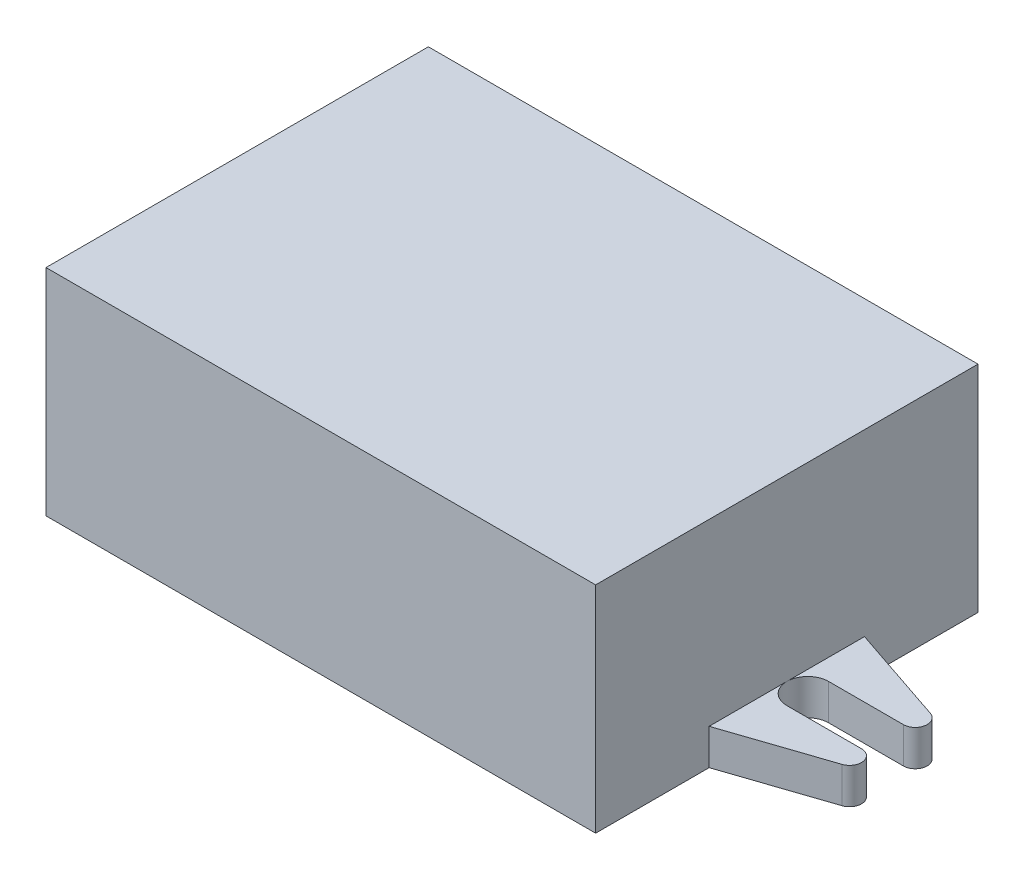
ISO-10303-21;
HEADER;
FILE_DESCRIPTION(('STEP AP214'),'2;1');
FILE_NAME('part.step','',(''),(''),'','','');
FILE_SCHEMA(('AUTOMOTIVE_DESIGN { 1 0 10303 214 1 1 1 1 }'));
ENDSEC;
DATA;
#1=APPLICATION_CONTEXT('core data for automotive mechanical design processes');
#2=APPLICATION_PROTOCOL_DEFINITION('international standard','automotive_design',2000,#1);
#3=PRODUCT_CONTEXT('',#1,'mechanical');
#4=PRODUCT('Part','Part','',(#3));
#5=PRODUCT_RELATED_PRODUCT_CATEGORY('part','',(#4));
#6=PRODUCT_DEFINITION_FORMATION('','',#4);
#7=PRODUCT_DEFINITION_CONTEXT('part definition',#1,'design');
#8=PRODUCT_DEFINITION('design','',#6,#7);
#9=PRODUCT_DEFINITION_SHAPE('','',#8);
#10=(LENGTH_UNIT() NAMED_UNIT(*) SI_UNIT(.MILLI.,.METRE.));
#11=(NAMED_UNIT(*) PLANE_ANGLE_UNIT() SI_UNIT($,.RADIAN.));
#12=(NAMED_UNIT(*) SI_UNIT($,.STERADIAN.) SOLID_ANGLE_UNIT());
#13=UNCERTAINTY_MEASURE_WITH_UNIT(LENGTH_MEASURE(1.E-05),#10,'distance_accuracy_value','');
#14=(GEOMETRIC_REPRESENTATION_CONTEXT(3) GLOBAL_UNCERTAINTY_ASSIGNED_CONTEXT((#13)) GLOBAL_UNIT_ASSIGNED_CONTEXT((#10,
#11,#12)) REPRESENTATION_CONTEXT('',''));
#15=CARTESIAN_POINT('',(0.,0.,0.));
#16=DIRECTION('',(0.,0.,1.));
#17=DIRECTION('',(1.,0.,0.));
#18=AXIS2_PLACEMENT_3D('',#15,#16,#17);
#19=CARTESIAN_POINT('',(23.,18.,16.));
#20=DIRECTION('',(-1.,0.,0.));
#21=DIRECTION('',(0.,0.,1.));
#22=AXIS2_PLACEMENT_3D('',#19,#20,#21);
#23=PLANE('',#22);
#24=DIRECTION('',(0.,0.,-1.));
#25=VECTOR('',#24,1.);
#26=CARTESIAN_POINT('',(23.,0.,16.));
#27=LINE('',#26,#25);
#28=CARTESIAN_POINT('',(23.,0.,16.));
#29=VERTEX_POINT('',#28);
#30=CARTESIAN_POINT('',(23.,0.,6.5));
#31=VERTEX_POINT('',#30);
#32=EDGE_CURVE('E331',#29,#31,#27,.T.);
#33=ORIENTED_EDGE('',*,*,#32,.T.);
#34=DIRECTION('',(0.,-1.,0.));
#35=VECTOR('',#34,1.);
#36=CARTESIAN_POINT('',(23.,3.,6.5));
#37=LINE('',#36,#35);
#38=CARTESIAN_POINT('',(23.,3.,6.5));
#39=VERTEX_POINT('',#38);
#40=EDGE_CURVE('E218',#39,#31,#37,.T.);
#41=ORIENTED_EDGE('',*,*,#40,.F.);
#42=DIRECTION('',(0.,0.,1.));
#43=VECTOR('',#42,1.);
#44=CARTESIAN_POINT('',(23.,3.,0.));
#45=LINE('',#44,#43);
#46=CARTESIAN_POINT('',(23.,3.,0.));
#47=VERTEX_POINT('',#46);
#48=EDGE_CURVE('E206',#47,#39,#45,.T.);
#49=ORIENTED_EDGE('',*,*,#48,.F.);
#50=DIRECTION('',(0.,0.,1.));
#51=VECTOR('',#50,1.);
#52=CARTESIAN_POINT('',(23.,3.,0.));
#53=LINE('',#52,#51);
#54=CARTESIAN_POINT('',(23.,3.,-6.5));
#55=VERTEX_POINT('',#54);
#56=EDGE_CURVE('E55',#55,#47,#53,.T.);
#57=ORIENTED_EDGE('',*,*,#56,.F.);
#58=DIRECTION('',(0.,-1.,0.));
#59=VECTOR('',#58,1.);
#60=CARTESIAN_POINT('',(23.,3.,-6.5));
#61=LINE('',#60,#59);
#62=CARTESIAN_POINT('',(23.,0.,-6.5));
#63=VERTEX_POINT('',#62);
#64=EDGE_CURVE('E236',#55,#63,#61,.T.);
#65=ORIENTED_EDGE('',*,*,#64,.T.);
#66=CARTESIAN_POINT('',(23.,0.,-16.));
#67=VERTEX_POINT('',#66);
#68=EDGE_CURVE('E319',#63,#67,#27,.T.);
#69=ORIENTED_EDGE('',*,*,#68,.T.);
#70=DIRECTION('',(0.,-1.,0.));
#71=VECTOR('',#70,1.);
#72=CARTESIAN_POINT('',(23.,18.,-16.));
#73=LINE('',#72,#71);
#74=CARTESIAN_POINT('',(23.,18.,-16.));
#75=VERTEX_POINT('',#74);
#76=EDGE_CURVE('E11',#75,#67,#73,.T.);
#77=ORIENTED_EDGE('',*,*,#76,.F.);
#78=DIRECTION('',(0.,0.,-1.));
#79=VECTOR('',#78,1.);
#80=CARTESIAN_POINT('',(23.,18.,16.));
#81=LINE('',#80,#79);
#82=CARTESIAN_POINT('',(23.,18.,16.));
#83=VERTEX_POINT('',#82);
#84=EDGE_CURVE('E320',#83,#75,#81,.T.);
#85=ORIENTED_EDGE('',*,*,#84,.F.);
#86=DIRECTION('',(0.,-1.,0.));
#87=VECTOR('',#86,1.);
#88=CARTESIAN_POINT('',(23.,18.,16.));
#89=LINE('',#88,#87);
#90=EDGE_CURVE('E330',#83,#29,#89,.T.);
#91=ORIENTED_EDGE('',*,*,#90,.T.);
#92=EDGE_LOOP('',(#33,#41,#49,#57,#65,#69,#77,#85,#91));
#93=FACE_BOUND('',#92,.T.);
#94=ADVANCED_FACE('F41',(#93),#23,.F.);
#95=CARTESIAN_POINT('',(-23.,18.,16.));
#96=DIRECTION('',(1.,0.,0.));
#97=DIRECTION('',(0.,0.,-1.));
#98=AXIS2_PLACEMENT_3D('',#95,#96,#97);
#99=PLANE('',#98);
#100=DIRECTION('',(0.,-1.,0.));
#101=VECTOR('',#100,1.);
#102=CARTESIAN_POINT('',(-23.,3.,6.5));
#103=LINE('',#102,#101);
#104=CARTESIAN_POINT('',(-23.,3.,6.5));
#105=VERTEX_POINT('',#104);
#106=CARTESIAN_POINT('',(-23.,0.,6.5));
#107=VERTEX_POINT('',#106);
#108=EDGE_CURVE('E263',#105,#107,#103,.T.);
#109=ORIENTED_EDGE('',*,*,#108,.T.);
#110=DIRECTION('',(0.,0.,1.));
#111=VECTOR('',#110,1.);
#112=CARTESIAN_POINT('',(-23.,0.,16.));
#113=LINE('',#112,#111);
#114=CARTESIAN_POINT('',(-23.,0.,16.));
#115=VERTEX_POINT('',#114);
#116=EDGE_CURVE('E336',#107,#115,#113,.T.);
#117=ORIENTED_EDGE('',*,*,#116,.T.);
#118=DIRECTION('',(0.,-1.,0.));
#119=VECTOR('',#118,1.);
#120=CARTESIAN_POINT('',(-23.,18.,16.));
#121=LINE('',#120,#119);
#122=CARTESIAN_POINT('',(-23.,18.,16.));
#123=VERTEX_POINT('',#122);
#124=EDGE_CURVE('E342',#123,#115,#121,.T.);
#125=ORIENTED_EDGE('',*,*,#124,.F.);
#126=DIRECTION('',(0.,0.,1.));
#127=VECTOR('',#126,1.);
#128=CARTESIAN_POINT('',(-23.,18.,16.));
#129=LINE('',#128,#127);
#130=CARTESIAN_POINT('',(-23.,18.,-16.));
#131=VERTEX_POINT('',#130);
#132=EDGE_CURVE('E326',#131,#123,#129,.T.);
#133=ORIENTED_EDGE('',*,*,#132,.F.);
#134=DIRECTION('',(0.,-1.,0.));
#135=VECTOR('',#134,1.);
#136=CARTESIAN_POINT('',(-23.,18.,-16.));
#137=LINE('',#136,#135);
#138=CARTESIAN_POINT('',(-23.,0.,-16.));
#139=VERTEX_POINT('',#138);
#140=EDGE_CURVE('E48',#131,#139,#137,.T.);
#141=ORIENTED_EDGE('',*,*,#140,.T.);
#142=CARTESIAN_POINT('',(-23.,0.,-6.5));
#143=VERTEX_POINT('',#142);
#144=EDGE_CURVE('E337',#139,#143,#113,.T.);
#145=ORIENTED_EDGE('',*,*,#144,.T.);
#146=DIRECTION('',(0.,-1.,0.));
#147=VECTOR('',#146,1.);
#148=CARTESIAN_POINT('',(-23.,3.,-6.5));
#149=LINE('',#148,#147);
#150=CARTESIAN_POINT('',(-23.,3.,-6.5));
#151=VERTEX_POINT('',#150);
#152=EDGE_CURVE('E312',#151,#143,#149,.T.);
#153=ORIENTED_EDGE('',*,*,#152,.F.);
#154=DIRECTION('',(0.,0.,1.));
#155=VECTOR('',#154,1.);
#156=CARTESIAN_POINT('',(-23.,3.,0.));
#157=LINE('',#156,#155);
#158=CARTESIAN_POINT('',(-23.,3.,0.));
#159=VERTEX_POINT('',#158);
#160=EDGE_CURVE('E295',#151,#159,#157,.T.);
#161=ORIENTED_EDGE('',*,*,#160,.T.);
#162=DIRECTION('',(0.,0.,1.));
#163=VECTOR('',#162,1.);
#164=CARTESIAN_POINT('',(-23.,3.,0.));
#165=LINE('',#164,#163);
#166=EDGE_CURVE('E63',#159,#105,#165,.T.);
#167=ORIENTED_EDGE('',*,*,#166,.T.);
#168=EDGE_LOOP('',(#109,#117,#125,#133,#141,#145,#153,#161,#167));
#169=FACE_BOUND('',#168,.T.);
#170=ADVANCED_FACE('F348',(#169),#99,.F.);
#171=CARTESIAN_POINT('',(-23.,18.,-16.));
#172=DIRECTION('',(0.,0.,1.));
#173=DIRECTION('',(1.,0.,0.));
#174=AXIS2_PLACEMENT_3D('',#171,#172,#173);
#175=PLANE('',#174);
#176=DIRECTION('',(-1.,0.,0.));
#177=VECTOR('',#176,1.);
#178=CARTESIAN_POINT('',(-23.,0.,-16.));
#179=LINE('',#178,#177);
#180=EDGE_CURVE('E334',#67,#139,#179,.T.);
#181=ORIENTED_EDGE('',*,*,#180,.T.);
#182=ORIENTED_EDGE('',*,*,#140,.F.);
#183=DIRECTION('',(-1.,0.,0.));
#184=VECTOR('',#183,1.);
#185=CARTESIAN_POINT('',(-23.,18.,-16.));
#186=LINE('',#185,#184);
#187=EDGE_CURVE('E323',#75,#131,#186,.T.);
#188=ORIENTED_EDGE('',*,*,#187,.F.);
#189=ORIENTED_EDGE('',*,*,#76,.T.);
#190=EDGE_LOOP('',(#181,#182,#188,#189));
#191=FACE_BOUND('',#190,.T.);
#192=ADVANCED_FACE('F392',(#191),#175,.F.);
#193=CARTESIAN_POINT('',(-23.,18.,16.));
#194=DIRECTION('',(0.,0.,-1.));
#195=DIRECTION('',(-1.,0.,0.));
#196=AXIS2_PLACEMENT_3D('',#193,#194,#195);
#197=PLANE('',#196);
#198=DIRECTION('',(1.,0.,0.));
#199=VECTOR('',#198,1.);
#200=CARTESIAN_POINT('',(-23.,0.,16.));
#201=LINE('',#200,#199);
#202=EDGE_CURVE('E324',#115,#29,#201,.T.);
#203=ORIENTED_EDGE('',*,*,#202,.T.);
#204=ORIENTED_EDGE('',*,*,#90,.F.);
#205=DIRECTION('',(1.,0.,0.));
#206=VECTOR('',#205,1.);
#207=CARTESIAN_POINT('',(-23.,18.,16.));
#208=LINE('',#207,#206);
#209=EDGE_CURVE('E328',#123,#83,#208,.T.);
#210=ORIENTED_EDGE('',*,*,#209,.F.);
#211=ORIENTED_EDGE('',*,*,#124,.T.);
#212=EDGE_LOOP('',(#203,#204,#210,#211));
#213=FACE_BOUND('',#212,.T.);
#214=ADVANCED_FACE('F385',(#213),#197,.F.);
#215=CARTESIAN_POINT('',(0.,18.,0.));
#216=DIRECTION('',(0.,-1.,0.));
#217=DIRECTION('',(0.,0.,-1.));
#218=AXIS2_PLACEMENT_3D('',#215,#216,#217);
#219=PLANE('',#218);
#220=ORIENTED_EDGE('',*,*,#84,.T.);
#221=ORIENTED_EDGE('',*,*,#187,.T.);
#222=ORIENTED_EDGE('',*,*,#132,.T.);
#223=ORIENTED_EDGE('',*,*,#209,.T.);
#224=EDGE_LOOP('',(#220,#221,#222,#223));
#225=FACE_BOUND('',#224,.T.);
#226=ADVANCED_FACE('F391',(#225),#219,.F.);
#227=CARTESIAN_POINT('',(0.,0.,0.));
#228=DIRECTION('',(0.,-1.,0.));
#229=DIRECTION('',(0.,0.,-1.));
#230=AXIS2_PLACEMENT_3D('',#227,#228,#229);
#231=PLANE('',#230);
#232=ORIENTED_EDGE('',*,*,#32,.F.);
#233=ORIENTED_EDGE('',*,*,#202,.F.);
#234=ORIENTED_EDGE('',*,*,#116,.F.);
#235=DIRECTION('',(0.947679096420404,0.,0.319224576447064));
#236=VECTOR('',#235,1.);
#237=CARTESIAN_POINT('',(-4.31019557283608,0.,12.7956383913877));
#238=LINE('',#237,#236);
#239=CARTESIAN_POINT('',(-31.3192245764471,0.,3.69767909642041));
#240=VERTEX_POINT('',#239);
#241=EDGE_CURVE('E258',#240,#107,#238,.T.);
#242=ORIENTED_EDGE('',*,*,#241,.F.);
#243=CARTESIAN_POINT('',(-31.,0.,2.75));
#244=DIRECTION('',(0.,1.,0.));
#245=DIRECTION('',(0.,0.,1.));
#246=AXIS2_PLACEMENT_3D('',#243,#244,#245);
#247=CIRCLE('',#246,0.999999999999999);
#248=CARTESIAN_POINT('',(-31.,0.,1.75));
#249=VERTEX_POINT('',#248);
#250=EDGE_CURVE('E259',#249,#240,#247,.T.);
#251=ORIENTED_EDGE('',*,*,#250,.F.);
#252=DIRECTION('',(-1.,0.,0.));
#253=VECTOR('',#252,1.);
#254=CARTESIAN_POINT('',(0.,0.,1.75));
#255=LINE('',#254,#253);
#256=CARTESIAN_POINT('',(-24.75,0.,1.75));
#257=VERTEX_POINT('',#256);
#258=EDGE_CURVE('E254',#257,#249,#255,.T.);
#259=ORIENTED_EDGE('',*,*,#258,.F.);
#260=CARTESIAN_POINT('',(-24.75,0.,0.));
#261=DIRECTION('',(0.,1.,0.));
#262=DIRECTION('',(0.,0.,1.));
#263=AXIS2_PLACEMENT_3D('',#260,#261,#262);
#264=CIRCLE('',#263,1.75);
#265=CARTESIAN_POINT('',(-24.75,0.,-1.75));
#266=VERTEX_POINT('',#265);
#267=EDGE_CURVE('E306',#257,#266,#264,.T.);
#268=ORIENTED_EDGE('',*,*,#267,.T.);
#269=DIRECTION('',(-1.,0.,0.));
#270=VECTOR('',#269,1.);
#271=CARTESIAN_POINT('',(0.,0.,-1.75));
#272=LINE('',#271,#270);
#273=CARTESIAN_POINT('',(-31.,0.,-1.75));
#274=VERTEX_POINT('',#273);
#275=EDGE_CURVE('E303',#266,#274,#272,.T.);
#276=ORIENTED_EDGE('',*,*,#275,.T.);
#277=CARTESIAN_POINT('',(-31.,0.,-2.75));
#278=DIRECTION('',(0.,1.,0.));
#279=DIRECTION('',(0.,0.,1.));
#280=AXIS2_PLACEMENT_3D('',#277,#278,#279);
#281=CIRCLE('',#280,1.);
#282=CARTESIAN_POINT('',(-31.3192245764471,0.,-3.69767909642041));
#283=VERTEX_POINT('',#282);
#284=EDGE_CURVE('E280',#274,#283,#281,.F.);
#285=ORIENTED_EDGE('',*,*,#284,.T.);
#286=DIRECTION('',(0.947679096420404,0.,-0.319224576447064));
#287=VECTOR('',#286,1.);
#288=CARTESIAN_POINT('',(-4.31019557283608,0.,-12.7956383913877));
#289=LINE('',#288,#287);
#290=EDGE_CURVE('E289',#283,#143,#289,.T.);
#291=ORIENTED_EDGE('',*,*,#290,.T.);
#292=ORIENTED_EDGE('',*,*,#144,.F.);
#293=ORIENTED_EDGE('',*,*,#180,.F.);
#294=ORIENTED_EDGE('',*,*,#68,.F.);
#295=DIRECTION('',(-0.947679096420404,0.,-0.319224576447064));
#296=VECTOR('',#295,1.);
#297=CARTESIAN_POINT('',(4.31019557283607,0.,-12.7956383913877));
#298=LINE('',#297,#296);
#299=CARTESIAN_POINT('',(31.3192245764471,0.,-3.6976790964204));
#300=VERTEX_POINT('',#299);
#301=EDGE_CURVE('E228',#300,#63,#298,.T.);
#302=ORIENTED_EDGE('',*,*,#301,.F.);
#303=CARTESIAN_POINT('',(31.,0.,-2.75));
#304=DIRECTION('',(0.,1.,0.));
#305=DIRECTION('',(0.,0.,1.));
#306=AXIS2_PLACEMENT_3D('',#303,#304,#305);
#307=CIRCLE('',#306,0.999999999999999);
#308=CARTESIAN_POINT('',(31.,0.,-1.75));
#309=VERTEX_POINT('',#308);
#310=EDGE_CURVE('E240',#309,#300,#307,.T.);
#311=ORIENTED_EDGE('',*,*,#310,.F.);
#312=DIRECTION('',(1.,0.,0.));
#313=VECTOR('',#312,1.);
#314=CARTESIAN_POINT('',(0.,0.,-1.75));
#315=LINE('',#314,#313);
#316=CARTESIAN_POINT('',(24.75,0.,-1.75));
#317=VERTEX_POINT('',#316);
#318=EDGE_CURVE('E238',#317,#309,#315,.T.);
#319=ORIENTED_EDGE('',*,*,#318,.F.);
#320=CARTESIAN_POINT('',(24.75,0.,0.));
#321=DIRECTION('',(0.,1.,0.));
#322=DIRECTION('',(0.,0.,1.));
#323=AXIS2_PLACEMENT_3D('',#320,#321,#322);
#324=CIRCLE('',#323,1.75);
#325=CARTESIAN_POINT('',(24.75,0.,1.75));
#326=VERTEX_POINT('',#325);
#327=EDGE_CURVE('E204',#326,#317,#324,.F.);
#328=ORIENTED_EDGE('',*,*,#327,.F.);
#329=DIRECTION('',(1.,0.,0.));
#330=VECTOR('',#329,1.);
#331=CARTESIAN_POINT('',(0.,0.,1.75));
#332=LINE('',#331,#330);
#333=CARTESIAN_POINT('',(31.,0.,1.75));
#334=VERTEX_POINT('',#333);
#335=EDGE_CURVE('E188',#326,#334,#332,.T.);
#336=ORIENTED_EDGE('',*,*,#335,.T.);
#337=CARTESIAN_POINT('',(31.,0.,2.75));
#338=DIRECTION('',(0.,1.,0.));
#339=DIRECTION('',(0.,0.,1.));
#340=AXIS2_PLACEMENT_3D('',#337,#338,#339);
#341=CIRCLE('',#340,0.999999999999999);
#342=CARTESIAN_POINT('',(31.3192245764471,0.,3.6976790964204));
#343=VERTEX_POINT('',#342);
#344=EDGE_CURVE('E202',#334,#343,#341,.F.);
#345=ORIENTED_EDGE('',*,*,#344,.T.);
#346=DIRECTION('',(-0.947679096420404,0.,0.319224576447064));
#347=VECTOR('',#346,1.);
#348=CARTESIAN_POINT('',(4.31019557283608,0.,12.7956383913877));
#349=LINE('',#348,#347);
#350=EDGE_CURVE('E211',#343,#31,#349,.T.);
#351=ORIENTED_EDGE('',*,*,#350,.T.);
#352=EDGE_LOOP('',(#232,#233,#234,#242,#251,#259,#268,#276,#285,#291,#292,#293,#294,#302,#311,
#319,#328,#336,#345,#351));
#353=FACE_BOUND('',#352,.T.);
#354=ADVANCED_FACE('F200',(#353),#231,.T.);
#355=CARTESIAN_POINT('',(-31.,3.,-2.75));
#356=DIRECTION('',(0.,-1.,0.));
#357=DIRECTION('',(0.,0.,-1.));
#358=AXIS2_PLACEMENT_3D('',#355,#356,#357);
#359=CYLINDRICAL_SURFACE('',#358,1.);
#360=ORIENTED_EDGE('',*,*,#284,.F.);
#361=DIRECTION('',(0.,-1.,0.));
#362=VECTOR('',#361,1.);
#363=CARTESIAN_POINT('',(-31.,3.,-1.75));
#364=LINE('',#363,#362);
#365=CARTESIAN_POINT('',(-31.,3.,-1.75));
#366=VERTEX_POINT('',#365);
#367=EDGE_CURVE('E317',#366,#274,#364,.T.);
#368=ORIENTED_EDGE('',*,*,#367,.F.);
#369=CARTESIAN_POINT('',(-31.,3.,-2.75));
#370=DIRECTION('',(0.,1.,0.));
#371=DIRECTION('',(0.,0.,1.));
#372=AXIS2_PLACEMENT_3D('',#369,#370,#371);
#373=CIRCLE('',#372,1.);
#374=CARTESIAN_POINT('',(-31.3192245764471,3.,-3.69767909642041));
#375=VERTEX_POINT('',#374);
#376=EDGE_CURVE('E285',#366,#375,#373,.F.);
#377=ORIENTED_EDGE('',*,*,#376,.T.);
#378=DIRECTION('',(0.,-1.,0.));
#379=VECTOR('',#378,1.);
#380=CARTESIAN_POINT('',(-31.3192245764471,3.,-3.69767909642041));
#381=LINE('',#380,#379);
#382=EDGE_CURVE('E300',#375,#283,#381,.T.);
#383=ORIENTED_EDGE('',*,*,#382,.T.);
#384=EDGE_LOOP('',(#360,#368,#377,#383));
#385=FACE_BOUND('',#384,.T.);
#386=ADVANCED_FACE('F419',(#385),#359,.T.);
#387=CARTESIAN_POINT('',(0.,3.,-1.75));
#388=DIRECTION('',(0.,0.,1.));
#389=DIRECTION('',(1.,0.,0.));
#390=AXIS2_PLACEMENT_3D('',#387,#388,#389);
#391=PLANE('',#390);
#392=ORIENTED_EDGE('',*,*,#275,.F.);
#393=DIRECTION('',(0.,-1.,0.));
#394=VECTOR('',#393,1.);
#395=CARTESIAN_POINT('',(-24.75,3.,-1.75));
#396=LINE('',#395,#394);
#397=CARTESIAN_POINT('',(-24.75,3.,-1.75));
#398=VERTEX_POINT('',#397);
#399=EDGE_CURVE('E315',#398,#266,#396,.T.);
#400=ORIENTED_EDGE('',*,*,#399,.F.);
#401=DIRECTION('',(-1.,0.,0.));
#402=VECTOR('',#401,1.);
#403=CARTESIAN_POINT('',(0.,3.,-1.75));
#404=LINE('',#403,#402);
#405=EDGE_CURVE('E288',#398,#366,#404,.T.);
#406=ORIENTED_EDGE('',*,*,#405,.T.);
#407=ORIENTED_EDGE('',*,*,#367,.T.);
#408=EDGE_LOOP('',(#392,#400,#406,#407));
#409=FACE_BOUND('',#408,.T.);
#410=ADVANCED_FACE('F427',(#409),#391,.T.);
#411=CARTESIAN_POINT('',(-24.75,3.,0.));
#412=DIRECTION('',(0.,-1.,0.));
#413=DIRECTION('',(0.,0.,-1.));
#414=AXIS2_PLACEMENT_3D('',#411,#412,#413);
#415=CYLINDRICAL_SURFACE('',#414,1.75);
#416=ORIENTED_EDGE('',*,*,#267,.F.);
#417=DIRECTION('',(0.,-1.,0.));
#418=VECTOR('',#417,1.);
#419=CARTESIAN_POINT('',(-24.75,3.,1.75));
#420=LINE('',#419,#418);
#421=CARTESIAN_POINT('',(-24.75,3.,1.75));
#422=VERTEX_POINT('',#421);
#423=EDGE_CURVE('E266',#422,#257,#420,.T.);
#424=ORIENTED_EDGE('',*,*,#423,.F.);
#425=CARTESIAN_POINT('',(-24.75,3.,0.));
#426=DIRECTION('',(0.,1.,0.));
#427=DIRECTION('',(0.,0.,1.));
#428=AXIS2_PLACEMENT_3D('',#425,#426,#427);
#429=CIRCLE('',#428,1.75);
#430=EDGE_CURVE('E265',#422,#159,#429,.T.);
#431=ORIENTED_EDGE('',*,*,#430,.T.);
#432=CARTESIAN_POINT('',(-24.75,3.,0.));
#433=DIRECTION('',(0.,1.,0.));
#434=DIRECTION('',(0.,0.,1.));
#435=AXIS2_PLACEMENT_3D('',#432,#433,#434);
#436=CIRCLE('',#435,1.75);
#437=EDGE_CURVE('E292',#159,#398,#436,.T.);
#438=ORIENTED_EDGE('',*,*,#437,.T.);
#439=ORIENTED_EDGE('',*,*,#399,.T.);
#440=EDGE_LOOP('',(#416,#424,#431,#438,#439));
#441=FACE_BOUND('',#440,.T.);
#442=ADVANCED_FACE('F369',(#441),#415,.F.);
#443=CARTESIAN_POINT('',(-4.31019557283608,3.,-12.7956383913877));
#444=DIRECTION('',(-0.319224576447064,0.,-0.947679096420403));
#445=DIRECTION('',(-0.947679096420404,0.,0.319224576447064));
#446=AXIS2_PLACEMENT_3D('',#443,#444,#445);
#447=PLANE('',#446);
#448=ORIENTED_EDGE('',*,*,#290,.F.);
#449=ORIENTED_EDGE('',*,*,#382,.F.);
#450=DIRECTION('',(0.947679096420404,0.,-0.319224576447064));
#451=VECTOR('',#450,1.);
#452=CARTESIAN_POINT('',(-4.31019557283608,3.,-12.7956383913877));
#453=LINE('',#452,#451);
#454=EDGE_CURVE('E297',#375,#151,#453,.T.);
#455=ORIENTED_EDGE('',*,*,#454,.T.);
#456=ORIENTED_EDGE('',*,*,#152,.T.);
#457=EDGE_LOOP('',(#448,#449,#455,#456));
#458=FACE_BOUND('',#457,.T.);
#459=ADVANCED_FACE('F355',(#458),#447,.T.);
#460=CARTESIAN_POINT('',(0.,3.,0.));
#461=DIRECTION('',(0.,1.,0.));
#462=DIRECTION('',(0.,0.,1.));
#463=AXIS2_PLACEMENT_3D('',#460,#461,#462);
#464=PLANE('',#463);
#465=ORIENTED_EDGE('',*,*,#376,.F.);
#466=ORIENTED_EDGE('',*,*,#405,.F.);
#467=ORIENTED_EDGE('',*,*,#437,.F.);
#468=ORIENTED_EDGE('',*,*,#160,.F.);
#469=ORIENTED_EDGE('',*,*,#454,.F.);
#470=EDGE_LOOP('',(#465,#466,#467,#468,#469));
#471=FACE_BOUND('',#470,.T.);
#472=ADVANCED_FACE('F361',(#471),#464,.T.);
#473=CARTESIAN_POINT('',(0.,3.,1.75));
#474=DIRECTION('',(0.,0.,1.));
#475=DIRECTION('',(1.,0.,0.));
#476=AXIS2_PLACEMENT_3D('',#473,#474,#475);
#477=PLANE('',#476);
#478=ORIENTED_EDGE('',*,*,#258,.T.);
#479=DIRECTION('',(0.,-1.,0.));
#480=VECTOR('',#479,1.);
#481=CARTESIAN_POINT('',(-31.,3.,1.75));
#482=LINE('',#481,#480);
#483=CARTESIAN_POINT('',(-31.,3.,1.75));
#484=VERTEX_POINT('',#483);
#485=EDGE_CURVE('E255',#484,#249,#482,.T.);
#486=ORIENTED_EDGE('',*,*,#485,.F.);
#487=DIRECTION('',(-1.,0.,0.));
#488=VECTOR('',#487,1.);
#489=CARTESIAN_POINT('',(0.,3.,1.75));
#490=LINE('',#489,#488);
#491=EDGE_CURVE('E276',#422,#484,#490,.T.);
#492=ORIENTED_EDGE('',*,*,#491,.F.);
#493=ORIENTED_EDGE('',*,*,#423,.T.);
#494=EDGE_LOOP('',(#478,#486,#492,#493));
#495=FACE_BOUND('',#494,.T.);
#496=ADVANCED_FACE('F374',(#495),#477,.F.);
#497=CARTESIAN_POINT('',(-31.,3.,2.75));
#498=DIRECTION('',(0.,-1.,0.));
#499=DIRECTION('',(0.,0.,-1.));
#500=AXIS2_PLACEMENT_3D('',#497,#498,#499);
#501=CYLINDRICAL_SURFACE('',#500,0.999999999999999);
#502=ORIENTED_EDGE('',*,*,#250,.T.);
#503=DIRECTION('',(0.,-1.,0.));
#504=VECTOR('',#503,1.);
#505=CARTESIAN_POINT('',(-31.3192245764471,3.,3.69767909642041));
#506=LINE('',#505,#504);
#507=CARTESIAN_POINT('',(-31.3192245764471,3.,3.69767909642041));
#508=VERTEX_POINT('',#507);
#509=EDGE_CURVE('E260',#508,#240,#506,.T.);
#510=ORIENTED_EDGE('',*,*,#509,.F.);
#511=CARTESIAN_POINT('',(-31.,3.,2.75));
#512=DIRECTION('',(0.,1.,0.));
#513=DIRECTION('',(0.,0.,1.));
#514=AXIS2_PLACEMENT_3D('',#511,#512,#513);
#515=CIRCLE('',#514,0.999999999999999);
#516=EDGE_CURVE('E281',#484,#508,#515,.T.);
#517=ORIENTED_EDGE('',*,*,#516,.F.);
#518=ORIENTED_EDGE('',*,*,#485,.T.);
#519=EDGE_LOOP('',(#502,#510,#517,#518));
#520=FACE_BOUND('',#519,.T.);
#521=ADVANCED_FACE('F377',(#520),#501,.T.);
#522=CARTESIAN_POINT('',(-4.31019557283608,3.,12.7956383913877));
#523=DIRECTION('',(0.319224576447064,0.,-0.947679096420403));
#524=DIRECTION('',(-0.947679096420404,0.,-0.319224576447064));
#525=AXIS2_PLACEMENT_3D('',#522,#523,#524);
#526=PLANE('',#525);
#527=ORIENTED_EDGE('',*,*,#241,.T.);
#528=ORIENTED_EDGE('',*,*,#108,.F.);
#529=DIRECTION('',(0.947679096420404,0.,0.319224576447064));
#530=VECTOR('',#529,1.);
#531=CARTESIAN_POINT('',(-4.31019557283608,3.,12.7956383913877));
#532=LINE('',#531,#530);
#533=EDGE_CURVE('E278',#508,#105,#532,.T.);
#534=ORIENTED_EDGE('',*,*,#533,.F.);
#535=ORIENTED_EDGE('',*,*,#509,.T.);
#536=EDGE_LOOP('',(#527,#528,#534,#535));
#537=FACE_BOUND('',#536,.T.);
#538=ADVANCED_FACE('F380',(#537),#526,.F.);
#539=CARTESIAN_POINT('',(0.,3.,0.));
#540=DIRECTION('',(0.,1.,0.));
#541=DIRECTION('',(0.,0.,1.));
#542=AXIS2_PLACEMENT_3D('',#539,#540,#541);
#543=PLANE('',#542);
#544=ORIENTED_EDGE('',*,*,#491,.T.);
#545=ORIENTED_EDGE('',*,*,#516,.T.);
#546=ORIENTED_EDGE('',*,*,#533,.T.);
#547=ORIENTED_EDGE('',*,*,#166,.F.);
#548=ORIENTED_EDGE('',*,*,#430,.F.);
#549=EDGE_LOOP('',(#544,#545,#546,#547,#548));
#550=FACE_BOUND('',#549,.T.);
#551=ADVANCED_FACE('F366',(#550),#543,.T.);
#552=CARTESIAN_POINT('',(24.75,3.,0.));
#553=DIRECTION('',(0.,-1.,0.));
#554=DIRECTION('',(0.,0.,-1.));
#555=AXIS2_PLACEMENT_3D('',#552,#553,#554);
#556=CYLINDRICAL_SURFACE('',#555,1.75);
#557=ORIENTED_EDGE('',*,*,#327,.T.);
#558=DIRECTION('',(0.,-1.,0.));
#559=VECTOR('',#558,1.);
#560=CARTESIAN_POINT('',(24.75,3.,-1.75));
#561=LINE('',#560,#559);
#562=CARTESIAN_POINT('',(24.75,3.,-1.75));
#563=VERTEX_POINT('',#562);
#564=EDGE_CURVE('E251',#563,#317,#561,.T.);
#565=ORIENTED_EDGE('',*,*,#564,.F.);
#566=CARTESIAN_POINT('',(24.75,3.,0.));
#567=DIRECTION('',(0.,1.,0.));
#568=DIRECTION('',(0.,0.,1.));
#569=AXIS2_PLACEMENT_3D('',#566,#567,#568);
#570=CIRCLE('',#569,1.75);
#571=EDGE_CURVE('E227',#47,#563,#570,.F.);
#572=ORIENTED_EDGE('',*,*,#571,.F.);
#573=CARTESIAN_POINT('',(24.75,3.,0.));
#574=DIRECTION('',(0.,1.,0.));
#575=DIRECTION('',(0.,0.,1.));
#576=AXIS2_PLACEMENT_3D('',#573,#574,#575);
#577=CIRCLE('',#576,1.75);
#578=CARTESIAN_POINT('',(24.75,3.,1.75));
#579=VERTEX_POINT('',#578);
#580=EDGE_CURVE('E223',#579,#47,#577,.F.);
#581=ORIENTED_EDGE('',*,*,#580,.F.);
#582=DIRECTION('',(0.,-1.,0.));
#583=VECTOR('',#582,1.);
#584=CARTESIAN_POINT('',(24.75,3.,1.75));
#585=LINE('',#584,#583);
#586=EDGE_CURVE('E195',#579,#326,#585,.T.);
#587=ORIENTED_EDGE('',*,*,#586,.T.);
#588=EDGE_LOOP('',(#557,#565,#572,#581,#587));
#589=FACE_BOUND('',#588,.T.);
#590=ADVANCED_FACE('F485',(#589),#556,.F.);
#591=CARTESIAN_POINT('',(0.,3.,-1.75));
#592=DIRECTION('',(0.,0.,-1.));
#593=DIRECTION('',(-1.,0.,0.));
#594=AXIS2_PLACEMENT_3D('',#591,#592,#593);
#595=PLANE('',#594);
#596=ORIENTED_EDGE('',*,*,#318,.T.);
#597=DIRECTION('',(0.,-1.,0.));
#598=VECTOR('',#597,1.);
#599=CARTESIAN_POINT('',(31.,3.,-1.75));
#600=LINE('',#599,#598);
#601=CARTESIAN_POINT('',(31.,3.,-1.75));
#602=VERTEX_POINT('',#601);
#603=EDGE_CURVE('E248',#602,#309,#600,.T.);
#604=ORIENTED_EDGE('',*,*,#603,.F.);
#605=DIRECTION('',(1.,0.,0.));
#606=VECTOR('',#605,1.);
#607=CARTESIAN_POINT('',(0.,3.,-1.75));
#608=LINE('',#607,#606);
#609=EDGE_CURVE('E230',#563,#602,#608,.T.);
#610=ORIENTED_EDGE('',*,*,#609,.F.);
#611=ORIENTED_EDGE('',*,*,#564,.T.);
#612=EDGE_LOOP('',(#596,#604,#610,#611));
#613=FACE_BOUND('',#612,.T.);
#614=ADVANCED_FACE('F494',(#613),#595,.F.);
#615=CARTESIAN_POINT('',(31.,3.,-2.75));
#616=DIRECTION('',(0.,-1.,0.));
#617=DIRECTION('',(0.,0.,-1.));
#618=AXIS2_PLACEMENT_3D('',#615,#616,#617);
#619=CYLINDRICAL_SURFACE('',#618,0.999999999999999);
#620=ORIENTED_EDGE('',*,*,#310,.T.);
#621=DIRECTION('',(0.,-1.,0.));
#622=VECTOR('',#621,1.);
#623=CARTESIAN_POINT('',(31.3192245764471,3.,-3.6976790964204));
#624=LINE('',#623,#622);
#625=CARTESIAN_POINT('',(31.3192245764471,3.,-3.6976790964204));
#626=VERTEX_POINT('',#625);
#627=EDGE_CURVE('E245',#626,#300,#624,.T.);
#628=ORIENTED_EDGE('',*,*,#627,.F.);
#629=CARTESIAN_POINT('',(31.,3.,-2.75));
#630=DIRECTION('',(0.,1.,0.));
#631=DIRECTION('',(0.,0.,1.));
#632=AXIS2_PLACEMENT_3D('',#629,#630,#631);
#633=CIRCLE('',#632,0.999999999999999);
#634=EDGE_CURVE('E232',#602,#626,#633,.T.);
#635=ORIENTED_EDGE('',*,*,#634,.F.);
#636=ORIENTED_EDGE('',*,*,#603,.T.);
#637=EDGE_LOOP('',(#620,#628,#635,#636));
#638=FACE_BOUND('',#637,.T.);
#639=ADVANCED_FACE('F502',(#638),#619,.T.);
#640=CARTESIAN_POINT('',(4.31019557283607,3.,-12.7956383913877));
#641=DIRECTION('',(-0.319224576447064,0.,0.947679096420404));
#642=DIRECTION('',(0.947679096420404,0.,0.319224576447064));
#643=AXIS2_PLACEMENT_3D('',#640,#641,#642);
#644=PLANE('',#643);
#645=ORIENTED_EDGE('',*,*,#301,.T.);
#646=ORIENTED_EDGE('',*,*,#64,.F.);
#647=DIRECTION('',(-0.947679096420404,0.,-0.319224576447064));
#648=VECTOR('',#647,1.);
#649=CARTESIAN_POINT('',(4.31019557283607,3.,-12.7956383913877));
#650=LINE('',#649,#648);
#651=EDGE_CURVE('E234',#626,#55,#650,.T.);
#652=ORIENTED_EDGE('',*,*,#651,.F.);
#653=ORIENTED_EDGE('',*,*,#627,.T.);
#654=EDGE_LOOP('',(#645,#646,#652,#653));
#655=FACE_BOUND('',#654,.T.);
#656=ADVANCED_FACE('F511',(#655),#644,.F.);
#657=CARTESIAN_POINT('',(0.,3.,0.));
#658=DIRECTION('',(0.,1.,0.));
#659=DIRECTION('',(0.,0.,1.));
#660=AXIS2_PLACEMENT_3D('',#657,#658,#659);
#661=PLANE('',#660);
#662=ORIENTED_EDGE('',*,*,#56,.T.);
#663=ORIENTED_EDGE('',*,*,#571,.T.);
#664=ORIENTED_EDGE('',*,*,#609,.T.);
#665=ORIENTED_EDGE('',*,*,#634,.T.);
#666=ORIENTED_EDGE('',*,*,#651,.T.);
#667=EDGE_LOOP('',(#662,#663,#664,#665,#666));
#668=FACE_BOUND('',#667,.T.);
#669=ADVANCED_FACE('F520',(#668),#661,.T.);
#670=CARTESIAN_POINT('',(0.,3.,1.75));
#671=DIRECTION('',(0.,0.,-1.));
#672=DIRECTION('',(-1.,0.,0.));
#673=AXIS2_PLACEMENT_3D('',#670,#671,#672);
#674=PLANE('',#673);
#675=ORIENTED_EDGE('',*,*,#335,.F.);
#676=ORIENTED_EDGE('',*,*,#586,.F.);
#677=DIRECTION('',(1.,0.,0.));
#678=VECTOR('',#677,1.);
#679=CARTESIAN_POINT('',(0.,3.,1.75));
#680=LINE('',#679,#678);
#681=CARTESIAN_POINT('',(31.,3.,1.75));
#682=VERTEX_POINT('',#681);
#683=EDGE_CURVE('E190',#579,#682,#680,.T.);
#684=ORIENTED_EDGE('',*,*,#683,.T.);
#685=DIRECTION('',(0.,-1.,0.));
#686=VECTOR('',#685,1.);
#687=CARTESIAN_POINT('',(31.,3.,1.75));
#688=LINE('',#687,#686);
#689=EDGE_CURVE('E185',#682,#334,#688,.T.);
#690=ORIENTED_EDGE('',*,*,#689,.T.);
#691=EDGE_LOOP('',(#675,#676,#684,#690));
#692=FACE_BOUND('',#691,.T.);
#693=ADVANCED_FACE('F187',(#692),#674,.T.);
#694=CARTESIAN_POINT('',(4.31019557283608,3.,12.7956383913877));
#695=DIRECTION('',(0.319224576447064,0.,0.947679096420404));
#696=DIRECTION('',(0.947679096420404,0.,-0.319224576447064));
#697=AXIS2_PLACEMENT_3D('',#694,#695,#696);
#698=PLANE('',#697);
#699=ORIENTED_EDGE('',*,*,#350,.F.);
#700=DIRECTION('',(0.,-1.,0.));
#701=VECTOR('',#700,1.);
#702=CARTESIAN_POINT('',(31.3192245764471,3.,3.6976790964204));
#703=LINE('',#702,#701);
#704=CARTESIAN_POINT('',(31.3192245764471,3.,3.6976790964204));
#705=VERTEX_POINT('',#704);
#706=EDGE_CURVE('E209',#705,#343,#703,.T.);
#707=ORIENTED_EDGE('',*,*,#706,.F.);
#708=DIRECTION('',(-0.947679096420404,0.,0.319224576447064));
#709=VECTOR('',#708,1.);
#710=CARTESIAN_POINT('',(4.31019557283608,3.,12.7956383913877));
#711=LINE('',#710,#709);
#712=EDGE_CURVE('E219',#705,#39,#711,.T.);
#713=ORIENTED_EDGE('',*,*,#712,.T.);
#714=ORIENTED_EDGE('',*,*,#40,.T.);
#715=EDGE_LOOP('',(#699,#707,#713,#714));
#716=FACE_BOUND('',#715,.T.);
#717=ADVANCED_FACE('F537',(#716),#698,.T.);
#718=CARTESIAN_POINT('',(31.,3.,2.75));
#719=DIRECTION('',(0.,-1.,0.));
#720=DIRECTION('',(0.,0.,-1.));
#721=AXIS2_PLACEMENT_3D('',#718,#719,#720);
#722=CYLINDRICAL_SURFACE('',#721,0.999999999999999);
#723=ORIENTED_EDGE('',*,*,#344,.F.);
#724=ORIENTED_EDGE('',*,*,#689,.F.);
#725=CARTESIAN_POINT('',(31.,3.,2.75));
#726=DIRECTION('',(0.,1.,0.));
#727=DIRECTION('',(0.,0.,1.));
#728=AXIS2_PLACEMENT_3D('',#725,#726,#727);
#729=CIRCLE('',#728,0.999999999999999);
#730=EDGE_CURVE('E216',#682,#705,#729,.F.);
#731=ORIENTED_EDGE('',*,*,#730,.T.);
#732=ORIENTED_EDGE('',*,*,#706,.T.);
#733=EDGE_LOOP('',(#723,#724,#731,#732));
#734=FACE_BOUND('',#733,.T.);
#735=ADVANCED_FACE('F208',(#734),#722,.T.);
#736=CARTESIAN_POINT('',(0.,3.,0.));
#737=DIRECTION('',(0.,1.,0.));
#738=DIRECTION('',(0.,0.,1.));
#739=AXIS2_PLACEMENT_3D('',#736,#737,#738);
#740=PLANE('',#739);
#741=ORIENTED_EDGE('',*,*,#683,.F.);
#742=ORIENTED_EDGE('',*,*,#580,.T.);
#743=ORIENTED_EDGE('',*,*,#48,.T.);
#744=ORIENTED_EDGE('',*,*,#712,.F.);
#745=ORIENTED_EDGE('',*,*,#730,.F.);
#746=EDGE_LOOP('',(#741,#742,#743,#744,#745));
#747=FACE_BOUND('',#746,.T.);
#748=ADVANCED_FACE('F553',(#747),#740,.T.);
#749=CLOSED_SHELL('',(#94,#170,#192,#214,#226,#354,#386,#410,#442,#459,#472,#496,#521,#538,#551,
#590,#614,#639,#656,#669,#693,#717,#735,#748));
#750=MANIFOLD_SOLID_BREP('B2',#749);
#751=ADVANCED_BREP_SHAPE_REPRESENTATION('',(#18,#750),#14);
#752=SHAPE_DEFINITION_REPRESENTATION(#9,#751);
ENDSEC;
END-ISO-10303-21;
